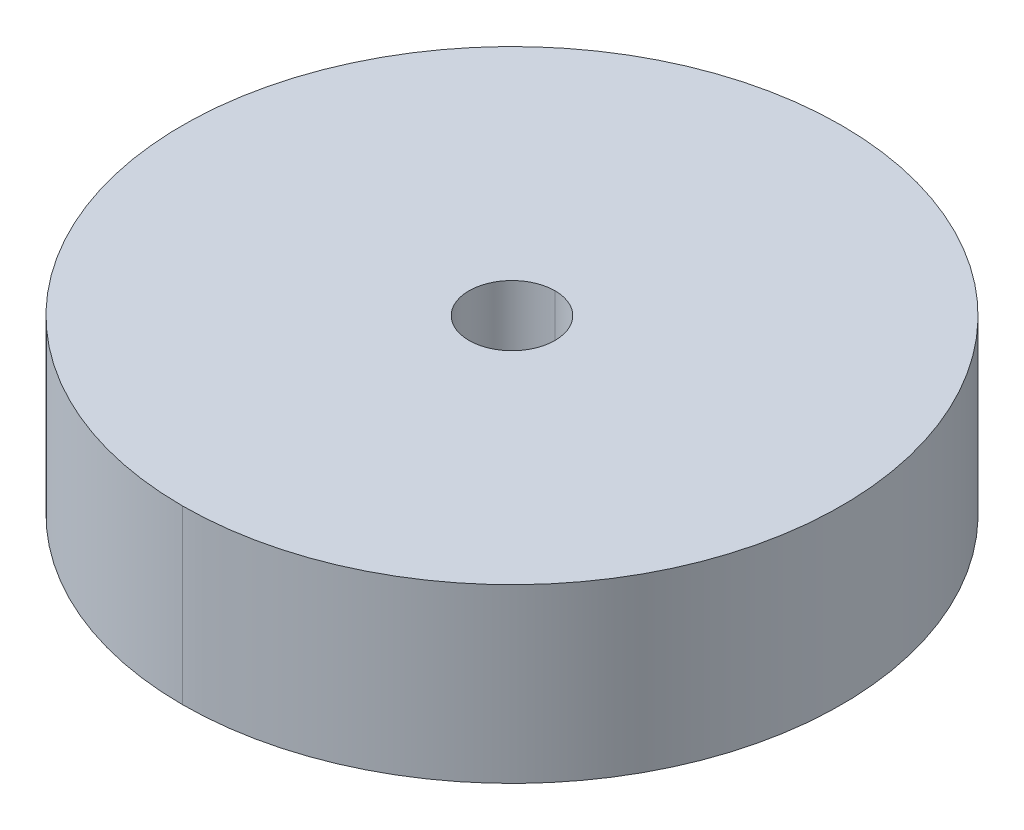
ISO-10303-21;
HEADER;
FILE_DESCRIPTION(('STEP AP214'),'2;1');
FILE_NAME('part.step','',(''),(''),'','','');
FILE_SCHEMA(('AUTOMOTIVE_DESIGN { 1 0 10303 214 1 1 1 1 }'));
ENDSEC;
DATA;
#1=APPLICATION_CONTEXT('core data for automotive mechanical design processes');
#2=APPLICATION_PROTOCOL_DEFINITION('international standard','automotive_design',2000,#1);
#3=PRODUCT_CONTEXT('',#1,'mechanical');
#4=PRODUCT('Part','Part','',(#3));
#5=PRODUCT_RELATED_PRODUCT_CATEGORY('part','',(#4));
#6=PRODUCT_DEFINITION_FORMATION('','',#4);
#7=PRODUCT_DEFINITION_CONTEXT('part definition',#1,'design');
#8=PRODUCT_DEFINITION('design','',#6,#7);
#9=PRODUCT_DEFINITION_SHAPE('','',#8);
#10=(LENGTH_UNIT() NAMED_UNIT(*) SI_UNIT(.MILLI.,.METRE.));
#11=(NAMED_UNIT(*) PLANE_ANGLE_UNIT() SI_UNIT($,.RADIAN.));
#12=(NAMED_UNIT(*) SI_UNIT($,.STERADIAN.) SOLID_ANGLE_UNIT());
#13=UNCERTAINTY_MEASURE_WITH_UNIT(LENGTH_MEASURE(1.E-05),#10,'distance_accuracy_value','');
#14=(GEOMETRIC_REPRESENTATION_CONTEXT(3) GLOBAL_UNCERTAINTY_ASSIGNED_CONTEXT((#13)) GLOBAL_UNIT_ASSIGNED_CONTEXT((#10,
#11,#12)) REPRESENTATION_CONTEXT('',''));
#15=CARTESIAN_POINT('',(0.,0.,0.));
#16=DIRECTION('',(0.,0.,1.));
#17=DIRECTION('',(1.,0.,0.));
#18=AXIS2_PLACEMENT_3D('',#15,#16,#17);
#19=CARTESIAN_POINT('',(2.164525,0.254,0.));
#20=DIRECTION('',(0.,-1.,0.));
#21=DIRECTION('',(0.,0.,-1.));
#22=AXIS2_PLACEMENT_3D('',#19,#20,#21);
#23=CYLINDRICAL_SURFACE('',#22,0.8);
#24=CARTESIAN_POINT('',(2.164525,0.254,0.));
#25=DIRECTION('',(0.,1.,0.));
#26=DIRECTION('',(0.,0.,1.));
#27=AXIS2_PLACEMENT_3D('',#24,#25,#26);
#28=CIRCLE('',#27,0.8);
#29=CARTESIAN_POINT('',(2.164525,0.254,-0.8));
#30=VERTEX_POINT('',#29);
#31=CARTESIAN_POINT('',(2.164525,0.254,0.8));
#32=VERTEX_POINT('',#31);
#33=EDGE_CURVE('E11',#30,#32,#28,.T.);
#34=ORIENTED_EDGE('',*,*,#33,.T.);
#35=DIRECTION('',(0.,-1.,0.));
#36=VECTOR('',#35,1.);
#37=CARTESIAN_POINT('',(2.164525,0.254,0.8));
#38=LINE('',#37,#36);
#39=CARTESIAN_POINT('',(2.164525,0.,0.8));
#40=VERTEX_POINT('',#39);
#41=EDGE_CURVE('E20',#32,#40,#38,.T.);
#42=ORIENTED_EDGE('',*,*,#41,.T.);
#43=CARTESIAN_POINT('',(2.164525,0.,0.));
#44=DIRECTION('',(0.,1.,0.));
#45=DIRECTION('',(0.,0.,1.));
#46=AXIS2_PLACEMENT_3D('',#43,#44,#45);
#47=CIRCLE('',#46,0.8);
#48=CARTESIAN_POINT('',(2.164525,0.,-0.8));
#49=VERTEX_POINT('',#48);
#50=EDGE_CURVE('E168',#49,#40,#47,.T.);
#51=ORIENTED_EDGE('',*,*,#50,.F.);
#52=DIRECTION('',(0.,-1.,0.));
#53=VECTOR('',#52,1.);
#54=CARTESIAN_POINT('',(2.164525,0.254,-0.8));
#55=LINE('',#54,#53);
#56=EDGE_CURVE('E175',#30,#49,#55,.T.);
#57=ORIENTED_EDGE('',*,*,#56,.F.);
#58=EDGE_LOOP('',(#34,#42,#51,#57));
#59=FACE_BOUND('',#58,.T.);
#60=ADVANCED_FACE('F16',(#59),#23,.F.);
#61=CARTESIAN_POINT('',(-2.164525,0.254,0.));
#62=DIRECTION('',(0.,-1.,0.));
#63=DIRECTION('',(0.,0.,-1.));
#64=AXIS2_PLACEMENT_3D('',#61,#62,#63);
#65=CYLINDRICAL_SURFACE('',#64,0.8);
#66=CARTESIAN_POINT('',(-2.164525,0.254,0.));
#67=DIRECTION('',(0.,1.,0.));
#68=DIRECTION('',(0.,0.,1.));
#69=AXIS2_PLACEMENT_3D('',#66,#67,#68);
#70=CIRCLE('',#69,0.8);
#71=CARTESIAN_POINT('',(-2.164525,0.254,-0.8));
#72=VERTEX_POINT('',#71);
#73=CARTESIAN_POINT('',(-2.164525,0.254,0.8));
#74=VERTEX_POINT('',#73);
#75=EDGE_CURVE('E196',#72,#74,#70,.T.);
#76=ORIENTED_EDGE('',*,*,#75,.T.);
#77=DIRECTION('',(0.,-1.,0.));
#78=VECTOR('',#77,1.);
#79=CARTESIAN_POINT('',(-2.164525,0.254,0.8));
#80=LINE('',#79,#78);
#81=CARTESIAN_POINT('',(-2.164525,0.,0.8));
#82=VERTEX_POINT('',#81);
#83=EDGE_CURVE('E142',#74,#82,#80,.T.);
#84=ORIENTED_EDGE('',*,*,#83,.T.);
#85=CARTESIAN_POINT('',(-2.164525,0.,0.));
#86=DIRECTION('',(0.,1.,0.));
#87=DIRECTION('',(0.,0.,1.));
#88=AXIS2_PLACEMENT_3D('',#85,#86,#87);
#89=CIRCLE('',#88,0.8);
#90=CARTESIAN_POINT('',(-2.164525,0.,-0.8));
#91=VERTEX_POINT('',#90);
#92=EDGE_CURVE('E108',#91,#82,#89,.T.);
#93=ORIENTED_EDGE('',*,*,#92,.F.);
#94=DIRECTION('',(0.,-1.,0.));
#95=VECTOR('',#94,1.);
#96=CARTESIAN_POINT('',(-2.164525,0.254,-0.8));
#97=LINE('',#96,#95);
#98=EDGE_CURVE('E97',#72,#91,#97,.T.);
#99=ORIENTED_EDGE('',*,*,#98,.F.);
#100=EDGE_LOOP('',(#76,#84,#93,#99));
#101=FACE_BOUND('',#100,.T.);
#102=ADVANCED_FACE('F18',(#101),#65,.F.);
#103=CARTESIAN_POINT('',(0.,2.,0.));
#104=DIRECTION('',(0.,-1.,0.));
#105=DIRECTION('',(0.,0.,-1.));
#106=AXIS2_PLACEMENT_3D('',#103,#104,#105);
#107=CYLINDRICAL_SURFACE('',#106,0.5);
#108=CARTESIAN_POINT('',(0.,2.,0.));
#109=DIRECTION('',(0.,1.,0.));
#110=DIRECTION('',(0.,0.,1.));
#111=AXIS2_PLACEMENT_3D('',#108,#109,#110);
#112=CIRCLE('',#111,0.5);
#113=CARTESIAN_POINT('',(0.,2.,-0.5));
#114=VERTEX_POINT('',#113);
#115=CARTESIAN_POINT('',(0.,2.,0.5));
#116=VERTEX_POINT('',#115);
#117=EDGE_CURVE('E135',#114,#116,#112,.T.);
#118=ORIENTED_EDGE('',*,*,#117,.T.);
#119=DIRECTION('',(0.,-1.,0.));
#120=VECTOR('',#119,1.);
#121=CARTESIAN_POINT('',(0.,2.,0.5));
#122=LINE('',#121,#120);
#123=CARTESIAN_POINT('',(0.,0.,0.5));
#124=VERTEX_POINT('',#123);
#125=EDGE_CURVE('E124',#116,#124,#122,.T.);
#126=ORIENTED_EDGE('',*,*,#125,.T.);
#127=CARTESIAN_POINT('',(0.,0.,0.));
#128=DIRECTION('',(0.,1.,0.));
#129=DIRECTION('',(0.,0.,1.));
#130=AXIS2_PLACEMENT_3D('',#127,#128,#129);
#131=CIRCLE('',#130,0.5);
#132=CARTESIAN_POINT('',(0.,0.,-0.5));
#133=VERTEX_POINT('',#132);
#134=EDGE_CURVE('E158',#133,#124,#131,.T.);
#135=ORIENTED_EDGE('',*,*,#134,.F.);
#136=DIRECTION('',(0.,-1.,0.));
#137=VECTOR('',#136,1.);
#138=CARTESIAN_POINT('',(0.,2.,-0.5));
#139=LINE('',#138,#137);
#140=EDGE_CURVE('E139',#114,#133,#139,.T.);
#141=ORIENTED_EDGE('',*,*,#140,.F.);
#142=EDGE_LOOP('',(#118,#126,#135,#141));
#143=FACE_BOUND('',#142,.T.);
#144=ADVANCED_FACE('F138',(#143),#107,.F.);
#145=CARTESIAN_POINT('',(0.,2.,0.));
#146=DIRECTION('',(0.,-1.,0.));
#147=DIRECTION('',(0.,0.,-1.));
#148=AXIS2_PLACEMENT_3D('',#145,#146,#147);
#149=CYLINDRICAL_SURFACE('',#148,3.82905);
#150=CARTESIAN_POINT('',(0.,2.,0.));
#151=DIRECTION('',(0.,1.,0.));
#152=DIRECTION('',(0.,0.,1.));
#153=AXIS2_PLACEMENT_3D('',#150,#151,#152);
#154=CIRCLE('',#153,3.82905);
#155=CARTESIAN_POINT('',(0.,2.,3.82905));
#156=VERTEX_POINT('',#155);
#157=CARTESIAN_POINT('',(0.,2.,-3.82905));
#158=VERTEX_POINT('',#157);
#159=EDGE_CURVE('E195',#156,#158,#154,.T.);
#160=ORIENTED_EDGE('',*,*,#159,.F.);
#161=DIRECTION('',(0.,-1.,0.));
#162=VECTOR('',#161,1.);
#163=CARTESIAN_POINT('',(0.,2.,3.82905));
#164=LINE('',#163,#162);
#165=CARTESIAN_POINT('',(0.,0.,3.82905));
#166=VERTEX_POINT('',#165);
#167=EDGE_CURVE('E136',#156,#166,#164,.T.);
#168=ORIENTED_EDGE('',*,*,#167,.T.);
#169=CARTESIAN_POINT('',(0.,0.,0.));
#170=DIRECTION('',(0.,1.,0.));
#171=DIRECTION('',(0.,0.,1.));
#172=AXIS2_PLACEMENT_3D('',#169,#170,#171);
#173=CIRCLE('',#172,3.82905);
#174=CARTESIAN_POINT('',(0.,0.,-3.82905));
#175=VERTEX_POINT('',#174);
#176=EDGE_CURVE('E67',#166,#175,#173,.T.);
#177=ORIENTED_EDGE('',*,*,#176,.T.);
#178=DIRECTION('',(0.,-1.,0.));
#179=VECTOR('',#178,1.);
#180=CARTESIAN_POINT('',(0.,2.,-3.82905));
#181=LINE('',#180,#179);
#182=EDGE_CURVE('E84',#158,#175,#181,.T.);
#183=ORIENTED_EDGE('',*,*,#182,.F.);
#184=EDGE_LOOP('',(#160,#168,#177,#183));
#185=FACE_BOUND('',#184,.T.);
#186=ADVANCED_FACE('F234',(#185),#149,.T.);
#187=CARTESIAN_POINT('',(0.,2.,0.));
#188=DIRECTION('',(0.,1.,0.));
#189=DIRECTION('',(1.,0.,0.));
#190=AXIS2_PLACEMENT_3D('',#187,#188,#189);
#191=PLANE('',#190);
#192=CARTESIAN_POINT('',(0.,2.,0.));
#193=DIRECTION('',(0.,1.,0.));
#194=DIRECTION('',(0.,0.,1.));
#195=AXIS2_PLACEMENT_3D('',#192,#193,#194);
#196=CIRCLE('',#195,3.82905);
#197=EDGE_CURVE('E192',#158,#156,#196,.T.);
#198=ORIENTED_EDGE('',*,*,#197,.T.);
#199=ORIENTED_EDGE('',*,*,#159,.T.);
#200=EDGE_LOOP('',(#198,#199));
#201=FACE_BOUND('',#200,.T.);
#202=ORIENTED_EDGE('',*,*,#117,.F.);
#203=CARTESIAN_POINT('',(0.,2.,0.));
#204=DIRECTION('',(0.,1.,0.));
#205=DIRECTION('',(0.,0.,1.));
#206=AXIS2_PLACEMENT_3D('',#203,#204,#205);
#207=CIRCLE('',#206,0.5);
#208=EDGE_CURVE('E129',#116,#114,#207,.T.);
#209=ORIENTED_EDGE('',*,*,#208,.F.);
#210=EDGE_LOOP('',(#202,#209));
#211=FACE_BOUND('',#210,.T.);
#212=ADVANCED_FACE('F144',(#201,#211),#191,.T.);
#213=CARTESIAN_POINT('',(0.,0.,0.));
#214=DIRECTION('',(0.,1.,0.));
#215=DIRECTION('',(1.,0.,0.));
#216=AXIS2_PLACEMENT_3D('',#213,#214,#215);
#217=PLANE('',#216);
#218=CARTESIAN_POINT('',(0.,0.,0.));
#219=DIRECTION('',(0.,1.,0.));
#220=DIRECTION('',(0.,0.,1.));
#221=AXIS2_PLACEMENT_3D('',#218,#219,#220);
#222=CIRCLE('',#221,3.82905);
#223=EDGE_CURVE('E146',#175,#166,#222,.T.);
#224=ORIENTED_EDGE('',*,*,#223,.F.);
#225=ORIENTED_EDGE('',*,*,#176,.F.);
#226=EDGE_LOOP('',(#224,#225));
#227=FACE_BOUND('',#226,.T.);
#228=ORIENTED_EDGE('',*,*,#50,.T.);
#229=CARTESIAN_POINT('',(2.164525,0.,0.));
#230=DIRECTION('',(0.,1.,0.));
#231=DIRECTION('',(0.,0.,1.));
#232=AXIS2_PLACEMENT_3D('',#229,#230,#231);
#233=CIRCLE('',#232,0.8);
#234=EDGE_CURVE('E161',#40,#49,#233,.T.);
#235=ORIENTED_EDGE('',*,*,#234,.T.);
#236=EDGE_LOOP('',(#228,#235));
#237=FACE_BOUND('',#236,.T.);
#238=ORIENTED_EDGE('',*,*,#92,.T.);
#239=CARTESIAN_POINT('',(-2.164525,0.,0.));
#240=DIRECTION('',(0.,1.,0.));
#241=DIRECTION('',(0.,0.,1.));
#242=AXIS2_PLACEMENT_3D('',#239,#240,#241);
#243=CIRCLE('',#242,0.8);
#244=EDGE_CURVE('E162',#82,#91,#243,.T.);
#245=ORIENTED_EDGE('',*,*,#244,.T.);
#246=EDGE_LOOP('',(#238,#245));
#247=FACE_BOUND('',#246,.T.);
#248=ORIENTED_EDGE('',*,*,#134,.T.);
#249=CARTESIAN_POINT('',(0.,0.,0.));
#250=DIRECTION('',(0.,1.,0.));
#251=DIRECTION('',(0.,0.,1.));
#252=AXIS2_PLACEMENT_3D('',#249,#250,#251);
#253=CIRCLE('',#252,0.5);
#254=EDGE_CURVE('E131',#124,#133,#253,.T.);
#255=ORIENTED_EDGE('',*,*,#254,.T.);
#256=EDGE_LOOP('',(#248,#255));
#257=FACE_BOUND('',#256,.T.);
#258=ADVANCED_FACE('F233',(#227,#237,#247,#257),#217,.F.);
#259=CARTESIAN_POINT('',(0.,2.,0.));
#260=DIRECTION('',(0.,-1.,0.));
#261=DIRECTION('',(0.,0.,-1.));
#262=AXIS2_PLACEMENT_3D('',#259,#260,#261);
#263=CYLINDRICAL_SURFACE('',#262,3.82905);
#264=ORIENTED_EDGE('',*,*,#167,.F.);
#265=ORIENTED_EDGE('',*,*,#197,.F.);
#266=ORIENTED_EDGE('',*,*,#182,.T.);
#267=ORIENTED_EDGE('',*,*,#223,.T.);
#268=EDGE_LOOP('',(#264,#265,#266,#267));
#269=FACE_BOUND('',#268,.T.);
#270=ADVANCED_FACE('F220',(#269),#263,.T.);
#271=CARTESIAN_POINT('',(0.,2.,0.));
#272=DIRECTION('',(0.,-1.,0.));
#273=DIRECTION('',(0.,0.,-1.));
#274=AXIS2_PLACEMENT_3D('',#271,#272,#273);
#275=CYLINDRICAL_SURFACE('',#274,0.5);
#276=ORIENTED_EDGE('',*,*,#125,.F.);
#277=ORIENTED_EDGE('',*,*,#208,.T.);
#278=ORIENTED_EDGE('',*,*,#140,.T.);
#279=ORIENTED_EDGE('',*,*,#254,.F.);
#280=EDGE_LOOP('',(#276,#277,#278,#279));
#281=FACE_BOUND('',#280,.T.);
#282=ADVANCED_FACE('F126',(#281),#275,.F.);
#283=CARTESIAN_POINT('',(-2.164525,0.254,0.));
#284=DIRECTION('',(0.,-1.,0.));
#285=DIRECTION('',(0.,0.,-1.));
#286=AXIS2_PLACEMENT_3D('',#283,#284,#285);
#287=CYLINDRICAL_SURFACE('',#286,0.8);
#288=ORIENTED_EDGE('',*,*,#83,.F.);
#289=CARTESIAN_POINT('',(-2.164525,0.254,0.));
#290=DIRECTION('',(0.,1.,0.));
#291=DIRECTION('',(0.,0.,1.));
#292=AXIS2_PLACEMENT_3D('',#289,#290,#291);
#293=CIRCLE('',#292,0.8);
#294=EDGE_CURVE('E154',#74,#72,#293,.T.);
#295=ORIENTED_EDGE('',*,*,#294,.T.);
#296=ORIENTED_EDGE('',*,*,#98,.T.);
#297=ORIENTED_EDGE('',*,*,#244,.F.);
#298=EDGE_LOOP('',(#288,#295,#296,#297));
#299=FACE_BOUND('',#298,.T.);
#300=ADVANCED_FACE('F207',(#299),#287,.F.);
#301=CARTESIAN_POINT('',(-2.164525,0.254,0.));
#302=DIRECTION('',(0.,1.,0.));
#303=DIRECTION('',(1.,0.,0.));
#304=AXIS2_PLACEMENT_3D('',#301,#302,#303);
#305=PLANE('',#304);
#306=ORIENTED_EDGE('',*,*,#75,.F.);
#307=ORIENTED_EDGE('',*,*,#294,.F.);
#308=EDGE_LOOP('',(#306,#307));
#309=FACE_BOUND('',#308,.T.);
#310=ADVANCED_FACE('F209',(#309),#305,.F.);
#311=CARTESIAN_POINT('',(2.164525,0.254,0.));
#312=DIRECTION('',(0.,-1.,0.));
#313=DIRECTION('',(0.,0.,-1.));
#314=AXIS2_PLACEMENT_3D('',#311,#312,#313);
#315=CYLINDRICAL_SURFACE('',#314,0.8);
#316=ORIENTED_EDGE('',*,*,#41,.F.);
#317=CARTESIAN_POINT('',(2.164525,0.254,0.));
#318=DIRECTION('',(0.,1.,0.));
#319=DIRECTION('',(0.,0.,1.));
#320=AXIS2_PLACEMENT_3D('',#317,#318,#319);
#321=CIRCLE('',#320,0.8);
#322=EDGE_CURVE('E179',#32,#30,#321,.T.);
#323=ORIENTED_EDGE('',*,*,#322,.T.);
#324=ORIENTED_EDGE('',*,*,#56,.T.);
#325=ORIENTED_EDGE('',*,*,#234,.F.);
#326=EDGE_LOOP('',(#316,#323,#324,#325));
#327=FACE_BOUND('',#326,.T.);
#328=ADVANCED_FACE('F217',(#327),#315,.F.);
#329=CARTESIAN_POINT('',(2.164525,0.254,0.));
#330=DIRECTION('',(0.,1.,0.));
#331=DIRECTION('',(1.,0.,0.));
#332=AXIS2_PLACEMENT_3D('',#329,#330,#331);
#333=PLANE('',#332);
#334=ORIENTED_EDGE('',*,*,#33,.F.);
#335=ORIENTED_EDGE('',*,*,#322,.F.);
#336=EDGE_LOOP('',(#334,#335));
#337=FACE_BOUND('',#336,.T.);
#338=ADVANCED_FACE('F236',(#337),#333,.F.);
#339=CLOSED_SHELL('',(#60,#102,#144,#186,#212,#258,#270,#282,#300,#310,#328,#338));
#340=MANIFOLD_SOLID_BREP('B1',#339);
#341=ADVANCED_BREP_SHAPE_REPRESENTATION('',(#18,#340),#14);
#342=SHAPE_DEFINITION_REPRESENTATION(#9,#341);
ENDSEC;
END-ISO-10303-21;
